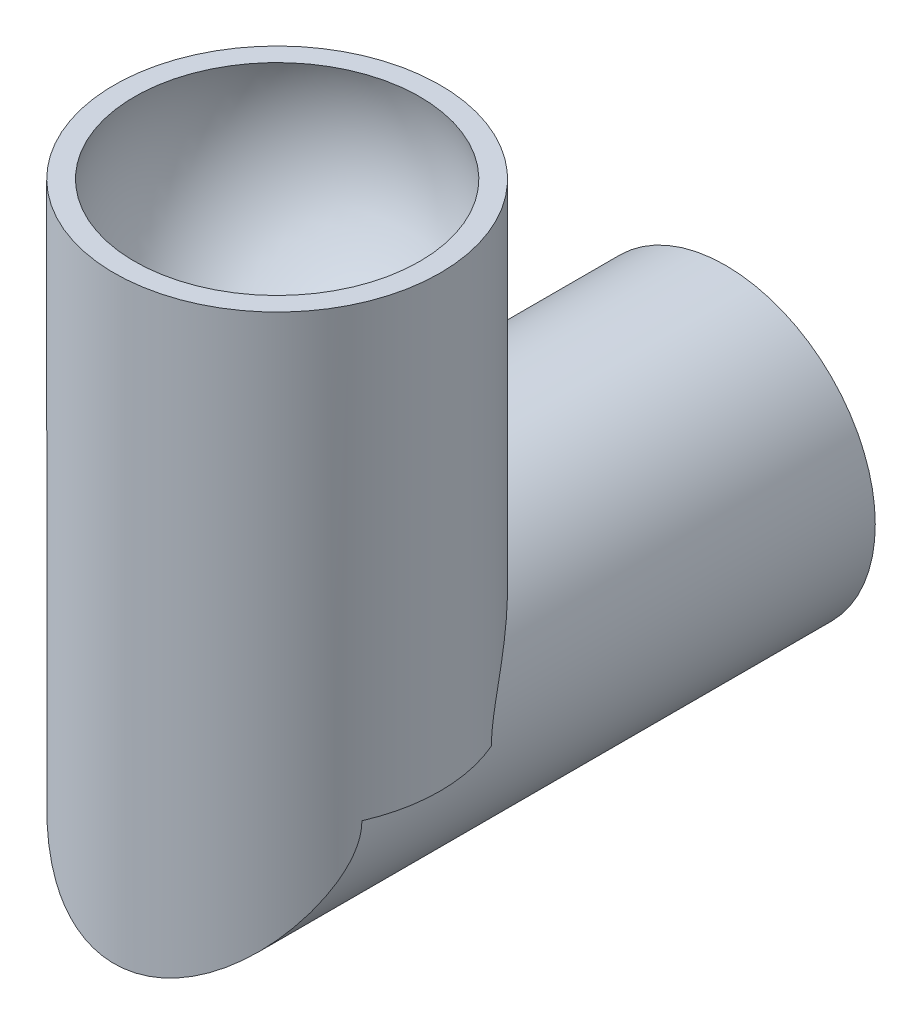
ISO-10303-21;
HEADER;
FILE_DESCRIPTION(('STEP AP214'),'2;1');
FILE_NAME('part.step','',(''),(''),'','','');
FILE_SCHEMA(('AUTOMOTIVE_DESIGN { 1 0 10303 214 1 1 1 1 }'));
ENDSEC;
DATA;
#1=APPLICATION_CONTEXT('core data for automotive mechanical design processes');
#2=APPLICATION_PROTOCOL_DEFINITION('international standard','automotive_design',2000,#1);
#3=PRODUCT_CONTEXT('',#1,'mechanical');
#4=PRODUCT('Part','Part','',(#3));
#5=PRODUCT_RELATED_PRODUCT_CATEGORY('part','',(#4));
#6=PRODUCT_DEFINITION_FORMATION('','',#4);
#7=PRODUCT_DEFINITION_CONTEXT('part definition',#1,'design');
#8=PRODUCT_DEFINITION('design','',#6,#7);
#9=PRODUCT_DEFINITION_SHAPE('','',#8);
#10=(LENGTH_UNIT() NAMED_UNIT(*) SI_UNIT(.MILLI.,.METRE.));
#11=(NAMED_UNIT(*) PLANE_ANGLE_UNIT() SI_UNIT($,.RADIAN.));
#12=(NAMED_UNIT(*) SI_UNIT($,.STERADIAN.) SOLID_ANGLE_UNIT());
#13=UNCERTAINTY_MEASURE_WITH_UNIT(LENGTH_MEASURE(1.E-05),#10,'distance_accuracy_value','');
#14=(GEOMETRIC_REPRESENTATION_CONTEXT(3) GLOBAL_UNCERTAINTY_ASSIGNED_CONTEXT((#13)) GLOBAL_UNIT_ASSIGNED_CONTEXT((#10,
#11,#12)) REPRESENTATION_CONTEXT('',''));
#15=CARTESIAN_POINT('',(0.,0.,0.));
#16=DIRECTION('',(0.,0.,1.));
#17=DIRECTION('',(1.,0.,0.));
#18=AXIS2_PLACEMENT_3D('',#15,#16,#17);
#19=CARTESIAN_POINT('',(0.,0.,0.));
#20=DIRECTION('',(0.,1.,0.));
#21=DIRECTION('',(1.,0.,0.));
#22=AXIS2_PLACEMENT_3D('',#19,#20,#21);
#23=SPHERICAL_SURFACE('',#22,20.);
#24=CARTESIAN_POINT('',(0.,-17.3205080756888,0.));
#25=DIRECTION('',(0.,1.,0.));
#26=DIRECTION('',(0.,0.,1.));
#27=AXIS2_PLACEMENT_3D('',#24,#25,#26);
#28=CIRCLE('',#27,10.);
#29=CARTESIAN_POINT('',(10.,-17.3205080756888,0.));
#30=VERTEX_POINT('',#29);
#31=EDGE_CURVE('E41',#30,#30,#28,.T.);
#32=ORIENTED_EDGE('',*,*,#31,.F.);
#33=CARTESIAN_POINT('',(0.,0.,0.));
#34=DIRECTION('',(0.,0.,-1.));
#35=DIRECTION('',(1.,0.,0.));
#36=AXIS2_PLACEMENT_3D('',#33,#34,#35);
#37=CIRCLE('',#36,20.);
#38=CARTESIAN_POINT('',(19.0787840283389,6.,0.));
#39=VERTEX_POINT('',#38);
#40=EDGE_CURVE('E125',#39,#30,#37,.T.);
#41=ORIENTED_EDGE('',*,*,#40,.F.);
#42=CARTESIAN_POINT('',(0.,6.,0.));
#43=DIRECTION('',(0.,1.,0.));
#44=DIRECTION('',(1.,0.,0.));
#45=AXIS2_PLACEMENT_3D('',#42,#43,#44);
#46=CIRCLE('',#45,19.0787840283389);
#47=EDGE_CURVE('E47',#39,#39,#46,.T.);
#48=ORIENTED_EDGE('',*,*,#47,.T.);
#49=ORIENTED_EDGE('',*,*,#40,.T.);
#50=EDGE_LOOP('',(#32,#41,#48,#49));
#51=FACE_BOUND('',#50,.T.);
#52=ADVANCED_FACE('F38',(#51),#23,.F.);
#53=CARTESIAN_POINT('',(0.,-54.,0.));
#54=DIRECTION('',(0.,1.,0.));
#55=DIRECTION('',(0.,0.,1.));
#56=AXIS2_PLACEMENT_3D('',#53,#54,#55);
#57=PLANE('',#56);
#58=DIRECTION('',(0.,0.,-1.));
#59=VECTOR('',#58,1.);
#60=CARTESIAN_POINT('',(20.,-54.,21.7954947177034));
#61=LINE('',#60,#59);
#62=CARTESIAN_POINT('',(20.,-54.,-8.66025403784439));
#63=VERTEX_POINT('',#62);
#64=CARTESIAN_POINT('',(20.,-54.,0.));
#65=VERTEX_POINT('',#64);
#66=EDGE_CURVE('E149',#63,#65,#61,.F.);
#67=ORIENTED_EDGE('',*,*,#66,.F.);
#68=CARTESIAN_POINT('',(0.,-54.,0.));
#69=DIRECTION('',(0.,1.,0.));
#70=DIRECTION('',(1.,0.,0.));
#71=AXIS2_PLACEMENT_3D('',#68,#69,#70);
#72=CIRCLE('',#71,21.7944947177034);
#73=CARTESIAN_POINT('',(21.7944947177034,-54.,0.));
#74=VERTEX_POINT('',#73);
#75=EDGE_CURVE('E141',#74,#63,#72,.T.);
#76=ORIENTED_EDGE('',*,*,#75,.F.);
#77=DIRECTION('',(1.,0.,0.));
#78=VECTOR('',#77,1.);
#79=CARTESIAN_POINT('',(0.,-54.,0.));
#80=LINE('',#79,#78);
#81=EDGE_CURVE('E144',#65,#74,#80,.T.);
#82=ORIENTED_EDGE('',*,*,#81,.F.);
#83=EDGE_LOOP('',(#67,#76,#82));
#84=FACE_BOUND('',#83,.T.);
#85=ADVANCED_FACE('F118',(#84),#57,.F.);
#86=CARTESIAN_POINT('',(20.,-54.,8.66025403784439));
#87=VERTEX_POINT('',#86);
#88=EDGE_CURVE('E58',#65,#87,#61,.F.);
#89=ORIENTED_EDGE('',*,*,#88,.F.);
#90=ORIENTED_EDGE('',*,*,#81,.T.);
#91=EDGE_CURVE('E129',#87,#74,#72,.T.);
#92=ORIENTED_EDGE('',*,*,#91,.F.);
#93=EDGE_LOOP('',(#89,#90,#92));
#94=FACE_BOUND('',#93,.T.);
#95=ADVANCED_FACE('F178',(#94),#57,.F.);
#96=DIRECTION('',(0.,0.,-1.));
#97=VECTOR('',#96,1.);
#98=CARTESIAN_POINT('',(-20.,-54.,21.7954947177034));
#99=LINE('',#98,#97);
#100=CARTESIAN_POINT('',(-20.,-54.,8.66025403784439));
#101=VERTEX_POINT('',#100);
#102=CARTESIAN_POINT('',(-20.,-54.,-8.66025403784439));
#103=VERTEX_POINT('',#102);
#104=EDGE_CURVE('E106',#101,#103,#99,.T.);
#105=ORIENTED_EDGE('',*,*,#104,.F.);
#106=EDGE_CURVE('E147',#103,#101,#72,.T.);
#107=ORIENTED_EDGE('',*,*,#106,.F.);
#108=EDGE_LOOP('',(#105,#107));
#109=FACE_BOUND('',#108,.T.);
#110=ADVANCED_FACE('F116',(#109),#57,.F.);
#111=CARTESIAN_POINT('',(0.,0.,0.));
#112=DIRECTION('',(0.,1.,0.));
#113=DIRECTION('',(0.,0.,1.));
#114=AXIS2_PLACEMENT_3D('',#111,#112,#113);
#115=CYLINDRICAL_SURFACE('',#114,21.7944947177034);
#116=ORIENTED_EDGE('',*,*,#106,.T.);
#117=CARTESIAN_POINT('',(-20.,-54.,8.66025403784439));
#118=CARTESIAN_POINT('',(-20.0000002181586,-53.7173098730834,8.66025323613514));
#119=CARTESIAN_POINT('',(-19.9939860074078,-53.4346227360958,8.67418250162669));
#120=CARTESIAN_POINT('',(-19.9701699644675,-52.872380670673,8.72887003086645));
#121=CARTESIAN_POINT('',(-19.9523667338552,-52.5928261178286,8.7696314774655));
#122=CARTESIAN_POINT('',(-19.905507299474,-52.0382156924432,8.87547768294981));
#123=CARTESIAN_POINT('',(-19.8764050631632,-51.7631830828896,8.94066190256756));
#124=CARTESIAN_POINT('',(-19.807757223014,-51.2201184296182,9.09173293742635));
#125=CARTESIAN_POINT('',(-19.7682057411567,-50.9520904197519,9.17763140268163));
#126=CARTESIAN_POINT('',(-19.6903162183122,-50.4882373422918,9.34332145557701));
#127=CARTESIAN_POINT('',(-19.6540351984894,-50.290746772801,9.41949230992989));
#128=CARTESIAN_POINT('',(-19.5763028148616,-49.9002469285364,9.57999661365893));
#129=CARTESIAN_POINT('',(-19.5348531396497,-49.7072362145149,9.66432739519051));
#130=CARTESIAN_POINT('',(-19.4030789128736,-49.1343792145296,9.92768455001428));
#131=CARTESIAN_POINT('',(-19.3053678638448,-48.7609345853959,10.1169916028781));
#132=CARTESIAN_POINT('',(-19.0915856428432,-48.0286255098291,10.5148760412783));
#133=CARTESIAN_POINT('',(-18.9754601412268,-47.6698082867448,10.7235096653294));
#134=CARTESIAN_POINT('',(-18.7260196975912,-46.9661198045016,11.1533826634754));
#135=CARTESIAN_POINT('',(-18.5927076303157,-46.6212462256768,11.3746199259524));
#136=CARTESIAN_POINT('',(-18.3221604052598,-45.9744162228442,11.8049632974064));
#137=CARTESIAN_POINT('',(-18.1863566954197,-45.6713897310386,12.0133706341887));
#138=CARTESIAN_POINT('',(-17.9011153936051,-45.0747887144134,12.434417778129));
#139=CARTESIAN_POINT('',(-17.7516760063951,-44.7812154410819,12.6470581397058));
#140=CARTESIAN_POINT('',(-17.4391496320678,-44.2028493752021,13.0746406943699));
#141=CARTESIAN_POINT('',(-17.2760550564861,-43.9180615868362,13.289584108677));
#142=CARTESIAN_POINT('',(-16.9362549350535,-43.3571261090856,13.7200039122352));
#143=CARTESIAN_POINT('',(-16.7595480995997,-43.0809792418209,13.9354803501077));
#144=CARTESIAN_POINT('',(-16.2093225689949,-42.2659643364856,14.5800035815113));
#145=CARTESIAN_POINT('',(-15.8152643829554,-41.7397182302326,15.0077476167439));
#146=CARTESIAN_POINT('',(-14.9715141105303,-40.7225788507391,15.8495735537612));
#147=CARTESIAN_POINT('',(-14.5218520875835,-40.2316666986108,16.2636626862855));
#148=CARTESIAN_POINT('',(-13.68619273838,-39.4075325962288,16.9678144329702));
#149=CARTESIAN_POINT('',(-13.3127531132741,-39.0657728746497,17.2628115670193));
#150=CARTESIAN_POINT('',(-12.5336032060727,-38.4061111498612,17.8365597238682));
#151=CARTESIAN_POINT('',(-12.1278932470843,-38.0882089078403,18.1153109092824));
#152=CARTESIAN_POINT('',(-11.28469027834,-37.4795396500141,18.6522146193207));
#153=CARTESIAN_POINT('',(-10.8472434301416,-37.1887345747347,18.9103959591732));
#154=CARTESIAN_POINT('',(-10.167496627424,-36.7752400346196,19.2792243884661));
#155=CARTESIAN_POINT('',(-9.93699754752422,-36.64120041839,19.3990875098621));
#156=CARTESIAN_POINT('',(-9.46816947821634,-36.3810996470987,19.6321755071993));
#157=CARTESIAN_POINT('',(-9.22983850285025,-36.2550405397672,19.7453986788418));
#158=CARTESIAN_POINT('',(-8.60122041397744,-35.9388231235526,20.0299503450528));
#159=CARTESIAN_POINT('',(-8.20503187527646,-35.7552434610646,20.195687755668));
#160=CARTESIAN_POINT('',(-7.39461327928373,-35.4120119892369,20.506290956209));
#161=CARTESIAN_POINT('',(-6.9803872151684,-35.2523549182834,20.6511613354265));
#162=CARTESIAN_POINT('',(-6.13563947302082,-34.9591568342897,20.9176953239157));
#163=CARTESIAN_POINT('',(-5.70512293260524,-34.8256076680522,21.039366177838));
#164=CARTESIAN_POINT('',(-4.83001811404516,-34.5866895870674,21.257333493972));
#165=CARTESIAN_POINT('',(-4.38542968348797,-34.4813209776608,21.3536296812452));
#166=CARTESIAN_POINT('',(-3.48213717464802,-34.3000431374666,21.5194551224761));
#167=CARTESIAN_POINT('',(-3.02335848288581,-34.2243360001877,21.5888007282639));
#168=CARTESIAN_POINT('',(-2.09817981942371,-34.1048958522434,21.6982625287673));
#169=CARTESIAN_POINT('',(-1.63177982700866,-34.0611629285006,21.7383786440219));
#170=CARTESIAN_POINT('',(-0.695597032782698,-34.006603011149,21.7884328297196));
#171=CARTESIAN_POINT('',(-0.225815436384534,-33.9957648226582,21.7983811669937));
#172=CARTESIAN_POINT('',(0.71297947005694,-34.0072018972209,21.787885835485));
#173=CARTESIAN_POINT('',(1.18199283907719,-34.0294744863835,21.7674446208382));
#174=CARTESIAN_POINT('',(2.06530577067367,-34.1025243962162,21.7004459283693));
#175=CARTESIAN_POINT('',(2.48011420442691,-34.1500144588067,21.6569006581961));
#176=CARTESIAN_POINT('',(3.30291137758265,-34.2702354772798,21.5467637132669));
#177=CARTESIAN_POINT('',(3.71090070280497,-34.3429642531369,21.4801740290024));
#178=CARTESIAN_POINT('',(4.51760394543257,-34.5125379052083,21.3251026467764));
#179=CARTESIAN_POINT('',(4.91631708819827,-34.6093847876403,21.2366191276227));
#180=CARTESIAN_POINT('',(5.7023327498304,-34.8258090333977,21.0391928175195));
#181=CARTESIAN_POINT('',(6.0896345963353,-34.9453877330165,20.9302488238024));
#182=CARTESIAN_POINT('',(6.86799952220862,-35.2115146474862,20.6882570544218));
#183=CARTESIAN_POINT('',(7.25846701372033,-35.3590240822068,20.5543542745734));
#184=CARTESIAN_POINT('',(8.02357744699046,-35.675328120127,20.2679327400102));
#185=CARTESIAN_POINT('',(8.39822038892056,-35.8441227230957,20.1154139854972));
#186=CARTESIAN_POINT('',(9.13071844067577,-36.2012349686342,19.7936865244603));
#187=CARTESIAN_POINT('',(9.48857039415525,-36.3895562606164,19.624474698397));
#188=CARTESIAN_POINT('',(10.186781511005,-36.7840094195481,19.2712902052198));
#189=CARTESIAN_POINT('',(10.5271369230765,-36.9901450807489,19.0873143941495));
#190=CARTESIAN_POINT('',(11.364351076302,-37.5314164664229,18.6062277709394));
#191=CARTESIAN_POINT('',(11.8493420109433,-37.8773645482935,18.3005177721728));
#192=CARTESIAN_POINT('',(12.7772364952457,-38.6022986621762,17.6651829896414));
#193=CARTESIAN_POINT('',(13.2201208475804,-38.9812996141784,17.3355474173067));
#194=CARTESIAN_POINT('',(14.0652328492838,-39.7696067867508,16.6572382246657));
#195=CARTESIAN_POINT('',(14.4673408966635,-40.1789963856201,16.3085129705188));
#196=CARTESIAN_POINT('',(15.2301122085117,-41.0243381677614,15.5985595859315));
#197=CARTESIAN_POINT('',(15.5907832301393,-41.4602853558981,15.2373338121623));
#198=CARTESIAN_POINT('',(16.2800253794634,-42.3684143764015,14.4990363382363));
#199=CARTESIAN_POINT('',(16.6075808508258,-42.8412260447671,14.1217937349732));
#200=CARTESIAN_POINT('',(17.2210021155938,-43.8133534925644,13.3668761897601));
#201=CARTESIAN_POINT('',(17.5068496355141,-44.3126807593654,12.9892011309378));
#202=CARTESIAN_POINT('',(17.9039335548015,-45.081928418759,12.4298609673716));
#203=CARTESIAN_POINT('',(18.0308814756909,-45.341400014826,12.2448253595736));
#204=CARTESIAN_POINT('',(18.2743136697814,-45.867745169372,11.8784581124939));
#205=CARTESIAN_POINT('',(18.3907991440065,-46.1346178736348,11.6971260499193));
#206=CARTESIAN_POINT('',(18.6130777358044,-46.6761393567482,11.3400850634718));
#207=CARTESIAN_POINT('',(18.7188790229736,-46.9507819854734,11.1643719144748));
#208=CARTESIAN_POINT('',(18.9196009774274,-47.5087297193632,10.8207326635737));
#209=CARTESIAN_POINT('',(19.0145241055511,-47.7920328469218,10.6528048056325));
#210=CARTESIAN_POINT('',(19.179996365797,-48.3260244707959,10.3514646896033));
#211=CARTESIAN_POINT('',(19.2520792626052,-48.5754141840353,10.2165989872973));
#212=CARTESIAN_POINT('',(19.3876114674734,-49.0817477001144,9.95700506127568));
#213=CARTESIAN_POINT('',(19.4510608938341,-49.3386913993864,9.83227669866193));
#214=CARTESIAN_POINT('',(19.5687069171389,-49.8603018351053,9.59599445434446));
#215=CARTESIAN_POINT('',(19.6229144289482,-50.1249590229126,9.4844250803392));
#216=CARTESIAN_POINT('',(19.7214494139646,-50.6624801407606,9.27779850370139));
#217=CARTESIAN_POINT('',(19.7657786963942,-50.9353425575858,9.18273827808174));
#218=CARTESIAN_POINT('',(19.8369291692729,-51.4407892821002,9.02785714096238));
#219=CARTESIAN_POINT('',(19.8654542591063,-51.6721311298799,8.96478304381243));
#220=CARTESIAN_POINT('',(19.9146562295311,-52.1394551446626,8.85494786165759));
#221=CARTESIAN_POINT('',(19.9353355770195,-52.3754358285129,8.80818164942183));
#222=CARTESIAN_POINT('',(19.9683543754352,-52.8504826225526,8.73307053278269));
#223=CARTESIAN_POINT('',(19.9807090588017,-53.0895422771683,8.70469198637119));
#224=CARTESIAN_POINT('',(19.9968071540248,-53.5694888735251,8.66764802734096));
#225=CARTESIAN_POINT('',(20.0005508688834,-53.8103757506708,8.65898192108285));
#226=CARTESIAN_POINT('',(19.9993166387462,-54.2925790937959,8.66183212934424));
#227=CARTESIAN_POINT('',(19.9943179417662,-54.5338952199114,8.67339646516107));
#228=CARTESIAN_POINT('',(19.975704692627,-55.0144234191864,8.71617773009543));
#229=CARTESIAN_POINT('',(19.9620898065274,-55.253635410431,8.74739542092381));
#230=CARTESIAN_POINT('',(19.9265718028857,-55.7287588052133,8.82800428845709));
#231=CARTESIAN_POINT('',(19.9046537266751,-55.9646634502093,8.87742826034796));
#232=CARTESIAN_POINT('',(19.8530126605036,-56.4316945290448,8.99232169524248));
#233=CARTESIAN_POINT('',(19.8232865704032,-56.6628190255379,9.05779753088235));
#234=CARTESIAN_POINT('',(19.7369088232229,-57.2540534969664,9.24501888743525));
#235=CARTESIAN_POINT('',(19.6747051023025,-57.6100516755527,9.37720652023174));
#236=CARTESIAN_POINT('',(19.533772653167,-58.3079829554824,9.66735365308522));
#237=CARTESIAN_POINT('',(19.4550319195193,-58.649905621505,9.825331857758));
#238=CARTESIAN_POINT('',(19.2821123728672,-59.3217368495311,10.1605044439271));
#239=CARTESIAN_POINT('',(19.1878762854084,-59.6515950698125,10.3377692582459));
#240=CARTESIAN_POINT('',(18.9851426861016,-60.2991631739882,10.7055342513119));
#241=CARTESIAN_POINT('',(18.876647328093,-60.6168748832556,10.8960324291367));
#242=CARTESIAN_POINT('',(18.6487245647575,-61.2339925447484,11.281579978573));
#243=CARTESIAN_POINT('',(18.5296195866636,-61.5336543644439,11.4764124586995));
#244=CARTESIAN_POINT('',(18.2786671294377,-62.1236132465017,11.8720356496559));
#245=CARTESIAN_POINT('',(18.1468175182173,-62.4139087310689,12.0728273535154));
#246=CARTESIAN_POINT('',(17.8704605331824,-62.9859671823818,12.478255754867));
#247=CARTESIAN_POINT('',(17.7259451690476,-63.2677246097864,12.6828948146346));
#248=CARTESIAN_POINT('',(17.4243705454878,-63.8229879270729,13.0941357589195));
#249=CARTESIAN_POINT('',(17.2673099980984,-64.0964929657331,13.3007378430494));
#250=CARTESIAN_POINT('',(16.7774202003165,-64.9048360239177,13.9210431335915));
#251=CARTESIAN_POINT('',(16.4257198716374,-65.4278384673526,14.335488121516));
#252=CARTESIAN_POINT('',(15.6714862894205,-66.4420035297239,15.156364251833));
#253=CARTESIAN_POINT('',(15.2689776990676,-66.9331814229408,15.5627991725174));
#254=CARTESIAN_POINT('',(14.4874463003141,-67.7982235176822,16.2894514428886));
#255=CARTESIAN_POINT('',(14.1168000280418,-68.1775004486168,16.6122331649453));
#256=CARTESIAN_POINT('',(13.3395254386684,-68.9111604327322,17.2426068417245));
#257=CARTESIAN_POINT('',(12.9328952446459,-69.2655421856491,17.550198002802));
#258=CARTESIAN_POINT('',(12.0839661204974,-69.9459404577074,18.1451329048207));
#259=CARTESIAN_POINT('',(11.6417288021715,-70.2720040267987,18.4325100736635));
#260=CARTESIAN_POINT('',(10.9515813888788,-70.7373785815998,18.8450183166093));
#261=CARTESIAN_POINT('',(10.7170853807976,-70.8885396440066,18.9794188738893));
#262=CARTESIAN_POINT('',(10.2391432280222,-71.1825108607972,19.2414717815902));
#263=CARTESIAN_POINT('',(9.99569486522776,-71.3253189225646,19.3691224402458));
#264=CARTESIAN_POINT('',(9.36515353753945,-71.6772719985997,19.6844336911376));
#265=CARTESIAN_POINT('',(8.97197865529389,-71.8802308028201,19.8669531051324));
#266=CARTESIAN_POINT('',(8.16581776719176,-72.2624853900226,20.2116687997454));
#267=CARTESIAN_POINT('',(7.75283644044906,-72.4417867247122,20.3738698480285));
#268=CARTESIAN_POINT('',(6.9085338101535,-72.7743955414388,20.6754203100173));
#269=CARTESIAN_POINT('',(6.47721725360813,-72.9277097009277,20.8147755936806));
#270=CARTESIAN_POINT('',(5.59826110090581,-73.2060394264467,21.068190186091));
#271=CARTESIAN_POINT('',(5.15062129057638,-73.3310546210193,21.1822491627938));
#272=CARTESIAN_POINT('',(4.23827719810069,-73.551442698056,21.3835657315225));
#273=CARTESIAN_POINT('',(3.77346698111548,-73.6465765565221,21.470607145194));
#274=CARTESIAN_POINT('',(2.83369637039559,-73.8039670702363,21.6147197358548));
#275=CARTESIAN_POINT('',(2.35873594805067,-73.8662236328009,21.6717908283556));
#276=CARTESIAN_POINT('',(1.40309503967203,-73.9564913385556,21.7545678457301));
#277=CARTESIAN_POINT('',(0.922417679138653,-73.9845203970156,21.7802901790747));
#278=CARTESIAN_POINT('',(-0.0403276556050364,-74.0057523853042,21.7997731206144));
#279=CARTESIAN_POINT('',(-0.522395475521236,-73.9989590410953,21.7935371483163));
#280=CARTESIAN_POINT('',(-1.42482967353366,-73.9536591911724,21.7519758237621));
#281=CARTESIAN_POINT('',(-1.8455724388862,-73.9191084845982,21.7202790575392));
#282=CARTESIAN_POINT('',(-2.68154055987439,-73.8238814369363,21.6329820412924));
#283=CARTESIAN_POINT('',(-3.09676645269123,-73.7632076589731,21.5773841363836));
#284=CARTESIAN_POINT('',(-3.91899529533253,-73.6167248845016,21.4432979495101));
#285=CARTESIAN_POINT('',(-4.32599785549287,-73.5309146998722,21.3648085855369));
#286=CARTESIAN_POINT('',(-5.12940480506747,-73.3354635791706,21.1862825935361));
#287=CARTESIAN_POINT('',(-5.52580863042417,-73.2258213775983,21.0862448212724));
#288=CARTESIAN_POINT('',(-6.3142245275019,-72.9816869005666,20.8638885243418));
#289=CARTESIAN_POINT('',(-6.7059700383375,-72.8467215878989,20.7411466332239));
#290=CARTESIAN_POINT('',(-7.47470630805457,-72.5552625621185,20.4766701255285));
#291=CARTESIAN_POINT('',(-7.85169731345702,-72.3987692088975,20.3349358264547));
#292=CARTESIAN_POINT('',(-8.58984098737207,-72.0659509788934,20.0343076432608));
#293=CARTESIAN_POINT('',(-8.95098960426935,-71.8896210696324,19.875409405107));
#294=CARTESIAN_POINT('',(-9.65657948442922,-71.5188295126264,19.5423324459834));
#295=CARTESIAN_POINT('',(-10.0010171835041,-71.324364022455,19.3681504872816));
#296=CARTESIAN_POINT('',(-10.8415418192467,-70.8169101146012,18.915324320168));
#297=CARTESIAN_POINT('',(-11.3268105376719,-70.4934871712489,18.6281877550802));
#298=CARTESIAN_POINT('',(-12.257711292,-69.8139474265422,18.0292852929359));
#299=CARTESIAN_POINT('',(-12.7033262333679,-69.4578166581646,17.7175088820781));
#300=CARTESIAN_POINT('',(-13.5558640332685,-68.7159290179478,17.0740838916891));
#301=CARTESIAN_POINT('',(-13.9626981640401,-68.3301076934879,16.7423924438954));
#302=CARTESIAN_POINT('',(-14.7370440634328,-67.5324980006376,16.0649969082087));
#303=CARTESIAN_POINT('',(-15.1045615671838,-67.1207134334805,15.7192948742166));
#304=CARTESIAN_POINT('',(-15.8093634698786,-66.2629311155817,15.0106477113269));
#305=CARTESIAN_POINT('',(-16.1457253546917,-65.8163539438068,14.6474881064216));
#306=CARTESIAN_POINT('',(-16.7789295132011,-64.8985552986156,13.9176497690795));
#307=CARTESIAN_POINT('',(-17.0757614029585,-64.4273273949199,13.5509701389971));
#308=CARTESIAN_POINT('',(-17.6298647676537,-63.4603449721211,12.8217338143147));
#309=CARTESIAN_POINT('',(-17.887196379649,-62.9646292864424,12.459171646366));
#310=CARTESIAN_POINT('',(-18.243630712511,-62.2005314374618,11.9254295865535));
#311=CARTESIAN_POINT('',(-18.3574988650917,-61.9424550592149,11.7492269247061));
#312=CARTESIAN_POINT('',(-18.5752737371482,-61.4188700108096,11.4018056212048));
#313=CARTESIAN_POINT('',(-18.6791817622579,-61.153362320704,11.2305863283553));
#314=CARTESIAN_POINT('',(-18.8788583157149,-60.608674622323,10.8916568131154));
#315=CARTESIAN_POINT('',(-18.9744142388035,-60.3293254521979,10.7240922486009));
#316=CARTESIAN_POINT('',(-19.1544990312926,-59.7614136841177,10.3990224105489));
#317=CARTESIAN_POINT('',(-19.2390305124482,-59.4728532885937,10.2415147589993));
#318=CARTESIAN_POINT('',(-19.3964797053749,-58.8855901373402,9.94009444862892));
#319=CARTESIAN_POINT('',(-19.469398130773,-58.586888006194,9.79618095466303));
#320=CARTESIAN_POINT('',(-19.6027461054577,-57.9785976669536,9.52653999439953));
#321=CARTESIAN_POINT('',(-19.6631776259258,-57.6690111861046,9.40080965865213));
#322=CARTESIAN_POINT('',(-19.7622374357159,-57.0866541029859,9.190505475247));
#323=CARTESIAN_POINT('',(-19.8027830867078,-56.8154315282569,9.1025811610462));
#324=CARTESIAN_POINT('',(-19.8731793752741,-56.2657103497799,8.94784827274143));
#325=CARTESIAN_POINT('',(-19.9030352872626,-55.9872154072665,8.88102928700017));
#326=CARTESIAN_POINT('',(-19.9511127555116,-55.425537977826,8.77249397271555));
#327=CARTESIAN_POINT('',(-19.9693834265862,-55.142380572361,8.73067171622278));
#328=CARTESIAN_POINT('',(-19.9938259956232,-54.5728140791058,8.67455429972265));
#329=CARTESIAN_POINT('',(-19.9999997789742,-54.2864055050337,8.66025485009046));
#330=CARTESIAN_POINT('',(-20.,-54.,8.66025403784439));
#331=B_SPLINE_CURVE_WITH_KNOTS('',3,(#117,#118,#119,#120,#121,#122,#123,#124,#125,#126,#127,
#128,#129,#130,#131,#132,#133,#134,#135,#136,#137,#138,#139,#140,#141,#142,#143,#144,#145,#146,
#147,#148,#149,#150,#151,#152,#153,#154,#155,#156,#157,#158,#159,#160,#161,#162,#163,#164,#165,
#166,#167,#168,#169,#170,#171,#172,#173,#174,#175,#176,#177,#178,#179,#180,#181,#182,#183,#184,
#185,#186,#187,#188,#189,#190,#191,#192,#193,#194,#195,#196,#197,#198,#199,#200,#201,#202,#203,
#204,#205,#206,#207,#208,#209,#210,#211,#212,#213,#214,#215,#216,#217,#218,#219,#220,#221,#222,
#223,#224,#225,#226,#227,#228,#229,#230,#231,#232,#233,#234,#235,#236,#237,#238,#239,#240,#241,
#242,#243,#244,#245,#246,#247,#248,#249,#250,#251,#252,#253,#254,#255,#256,#257,#258,#259,#260,
#261,#262,#263,#264,#265,#266,#267,#268,#269,#270,#271,#272,#273,#274,#275,#276,#277,#278,#279,
#280,#281,#282,#283,#284,#285,#286,#287,#288,#289,#290,#291,#292,#293,#294,#295,#296,#297,#298,
#299,#300,#301,#302,#303,#304,#305,#306,#307,#308,#309,#310,#311,#312,#313,#314,#315,#316,#317,
#318,#319,#320,#321,#322,#323,#324,#325,#326,#327,#328,#329,#330),.UNSPECIFIED.,.T.,.F.,(4,2,2,
2,2,2,2,2,2,2,2,2,2,2,2,2,2,2,2,2,2,2,2,2,2,2,2,2,2,2,2,2,2,2,2,2,2,2,2,2,2,2,2,2,2,2,2,2,2,2,2,
2,2,2,2,2,2,2,2,2,2,2,2,2,2,2,2,2,2,2,2,2,2,2,2,2,2,2,2,2,2,2,2,2,2,2,2,2,2,2,2,2,2,2,2,2,2,2,2,
2,2,2,2,2,2,2,4),(0.,0.847676572336322,1.69545371474494,2.54672159918146,3.39846937113223,
4.04246775462997,4.68625629319036,5.97456468357953,7.26674732623712,8.55871410924735,
9.73447136541326,10.910383642501,12.0869537912878,13.2636355437941,15.6137242496188,
17.9625478387531,19.7188073034611,21.4750491858071,23.2287859247675,24.1055630374938,
24.9825642194285,26.3822943248522,27.7817161156833,29.1807001826635,30.5796994072315,
31.9880712774351,33.396446976315,34.8043433167614,36.2121259674336,37.4700270658721,
38.727819538557,39.9857166732325,41.243687776467,42.5574748033206,43.8712618159192,
45.1852948109311,46.4996083725654,48.5053837667462,50.5120692966611,52.5244800634965,
54.5365134838732,56.5983548174334,58.6610968093735,59.6900245205646,60.7188339658617,
61.7468506851346,62.7746343871821,63.6519191065745,64.5291918036958,65.4054211391794,
66.2814898589165,67.0052883145524,67.7288590009304,68.4511020786025,69.1733197416649,
69.8972540703493,70.6212164584965,71.3464893568137,72.0720506581706,73.2244722795109,
74.3777334383849,75.5353573116346,76.6928065282358,77.8226517808163,78.9526863768603,
80.0834390701678,81.2143080029673,83.4747123813017,85.7340237106525,87.5948957749289,
89.4558649595699,91.3136805532467,92.2424507127904,93.1714525624838,94.605951023253,
96.0401122487044,97.4739044033462,98.9077153771145,100.352719517975,101.797727732385,
103.241979279767,104.686076296899,105.954613164494,107.22302559507,108.491497989302,
109.760037756951,111.055187906502,112.3503164072,113.645774222462,114.941507135571,
116.888674024925,118.836676301805,120.789033561233,122.7411056402,124.739423746316,
126.738265749643,128.734033778159,129.731593482847,130.729022242013,131.747065228357,
132.764866594526,133.782605392232,134.80018340684,135.663243216931,136.525876596742,
137.384828012151,138.243645543041),.UNSPECIFIED.);
#332=EDGE_CURVE('E97',#87,#101,#331,.T.);
#333=ORIENTED_EDGE('',*,*,#332,.F.);
#334=ORIENTED_EDGE('',*,*,#91,.T.);
#335=DIRECTION('',(0.,1.,0.));
#336=VECTOR('',#335,1.);
#337=CARTESIAN_POINT('',(21.7944947177034,6.,0.));
#338=LINE('',#337,#336);
#339=CARTESIAN_POINT('',(21.7944947177034,6.,0.));
#340=VERTEX_POINT('',#339);
#341=EDGE_CURVE('E137',#74,#340,#338,.T.);
#342=ORIENTED_EDGE('',*,*,#341,.T.);
#343=CARTESIAN_POINT('',(0.,6.,0.));
#344=DIRECTION('',(0.,1.,0.));
#345=DIRECTION('',(1.,0.,0.));
#346=AXIS2_PLACEMENT_3D('',#343,#344,#345);
#347=CIRCLE('',#346,21.7944947177034);
#348=EDGE_CURVE('E134',#340,#340,#347,.T.);
#349=ORIENTED_EDGE('',*,*,#348,.F.);
#350=ORIENTED_EDGE('',*,*,#341,.F.);
#351=ORIENTED_EDGE('',*,*,#75,.T.);
#352=CARTESIAN_POINT('',(-20.,-54.,-8.66025403784439));
#353=CARTESIAN_POINT('',(-20.0000032129467,-53.8566030924953,-8.66023805226546));
#354=CARTESIAN_POINT('',(-19.9984572156965,-53.7132355439203,-8.66381777264993));
#355=CARTESIAN_POINT('',(-19.9923007320043,-53.4269512319345,-8.67801831321608));
#356=CARTESIAN_POINT('',(-19.9876910307751,-53.2840343624444,-8.6886373292577));
#357=CARTESIAN_POINT('',(-19.9693565376571,-52.8573796470327,-8.73073778609742));
#358=CARTESIAN_POINT('',(-19.9511258681727,-52.5747851682296,-8.77246465479545));
#359=CARTESIAN_POINT('',(-19.9037445544616,-52.0209045220442,-8.87942781181461));
#360=CARTESIAN_POINT('',(-19.8748129109955,-51.7495053222279,-8.94419168210797));
#361=CARTESIAN_POINT('',(-19.8067743152776,-51.2134682453059,-9.09386905643543));
#362=CARTESIAN_POINT('',(-19.7676587369047,-50.9488363099921,-9.17879963693145));
#363=CARTESIAN_POINT('',(-19.6570832142784,-50.2903206014749,-9.41400913256731));
#364=CARTESIAN_POINT('',(-19.5794163706986,-49.9013935369153,-9.57520698535038));
#365=CARTESIAN_POINT('',(-19.4046023197538,-49.1405772737431,-9.92469780359373));
#366=CARTESIAN_POINT('',(-19.3074439015225,-48.7686980323566,-10.1130063444843));
#367=CARTESIAN_POINT('',(-19.0939883345038,-48.0362128562885,-10.5105241371624));
#368=CARTESIAN_POINT('',(-18.9774837645123,-47.6757859509745,-10.7199490148513));
#369=CARTESIAN_POINT('',(-18.7271401239107,-46.9690151573204,-11.1515241276392));
#370=CARTESIAN_POINT('',(-18.5933033217832,-46.6226694337836,-11.3736726953138));
#371=CARTESIAN_POINT('',(-18.3220061740112,-45.9740483759704,-11.8052083513778));
#372=CARTESIAN_POINT('',(-18.1860311101887,-45.6706634566571,-12.0138701605866));
#373=CARTESIAN_POINT('',(-17.9004144589291,-45.0733681207766,-12.4354334331172));
#374=CARTESIAN_POINT('',(-17.7507710307878,-44.7794589875357,-12.6483354644375));
#375=CARTESIAN_POINT('',(-17.4378058476573,-44.2004448693139,-13.0764397006763));
#376=CARTESIAN_POINT('',(-17.2744766645136,-43.9153447819873,-13.2916430986932));
#377=CARTESIAN_POINT('',(-16.9341747123195,-43.3538045124844,-13.7225785446372));
#378=CARTESIAN_POINT('',(-16.7572006498805,-43.0773651547539,-13.938310640798));
#379=CARTESIAN_POINT('',(-16.2069991728983,-42.2627990072837,-14.5825631469008));
#380=CARTESIAN_POINT('',(-15.8133134456314,-41.737244155311,-15.0097764172108));
#381=CARTESIAN_POINT('',(-14.9704392986637,-40.7214056970681,-15.8505632893512));
#382=CARTESIAN_POINT('',(-14.5212807888422,-40.2311033070256,-16.2641440904632));
#383=CARTESIAN_POINT('',(-13.6862746796058,-39.4076133864425,-16.9677453788576));
#384=CARTESIAN_POINT('',(-13.3129241632633,-39.0659294227935,-17.2626764382874));
#385=CARTESIAN_POINT('',(-12.5339670263686,-38.4064074529034,-17.8363009803469));
#386=CARTESIAN_POINT('',(-12.1283606929612,-38.0885692344337,-18.1149946074859));
#387=CARTESIAN_POINT('',(-11.2851868941886,-37.4798753001723,-18.6519170093395));
#388=CARTESIAN_POINT('',(-10.8476508251567,-37.1889937004234,-18.9101653802826));
#389=CARTESIAN_POINT('',(-10.1677593306574,-36.7753941918984,-19.279086606879));
#390=CARTESIAN_POINT('',(-9.93721022804156,-36.6413212316977,-19.3989793609264));
#391=CARTESIAN_POINT('',(-9.46827849656249,-36.3811573100162,-19.632123715507));
#392=CARTESIAN_POINT('',(-9.2298938808867,-36.2550683971026,-19.7453736110541));
#393=CARTESIAN_POINT('',(-8.60120551389194,-35.9388156279576,-20.0299570901452));
#394=CARTESIAN_POINT('',(-8.2050013436176,-35.7552293135854,-20.1957005279469));
#395=CARTESIAN_POINT('',(-7.3945501677428,-35.411986476475,-20.5063140739708));
#396=CARTESIAN_POINT('',(-6.98030715763666,-35.2523246890429,-20.6511887741754));
#397=CARTESIAN_POINT('',(-6.13555692351556,-34.9591306245138,-20.9177191918365));
#398=CARTESIAN_POINT('',(-5.70505609962234,-34.8255881904862,-21.0393839344029));
#399=CARTESIAN_POINT('',(-4.82998389646551,-34.5866814761436,-21.2573409066641));
#400=CARTESIAN_POINT('',(-4.38541236460119,-34.4813175015488,-21.3536328610783));
#401=CARTESIAN_POINT('',(-3.4821390225289,-34.3000435087729,-21.5194547827901));
#402=CARTESIAN_POINT('',(-3.02336221756375,-34.2243366165278,-21.5888001637226));
#403=CARTESIAN_POINT('',(-2.0981873630593,-34.1048966919471,-21.6982617589057));
#404=CARTESIAN_POINT('',(-1.63178929253685,-34.0611637476585,-21.7383778926673));
#405=CARTESIAN_POINT('',(-0.695606547549013,-34.0066032982268,-21.7884325662096));
#406=CARTESIAN_POINT('',(-0.225823049892303,-33.9957648639781,-21.7983811290774));
#407=CARTESIAN_POINT('',(0.712975668780073,-34.0072017168705,-21.787886000983));
#408=CARTESIAN_POINT('',(1.1819909487723,-34.0294743300785,-21.7674447641955));
#409=CARTESIAN_POINT('',(2.06530737208831,-34.1025245286324,-21.7004458069219));
#410=CARTESIAN_POINT('',(2.48011739160297,-34.1500148237612,-21.6569003235381));
#411=CARTESIAN_POINT('',(3.30291767341697,-34.2702364978958,-21.5467627785757));
#412=CARTESIAN_POINT('',(3.71090852155547,-34.3429656968075,-21.4801727075514));
#413=CARTESIAN_POINT('',(4.51761162426555,-34.5125397192789,-21.3251009891536));
#414=CARTESIAN_POINT('',(4.91632317558765,-34.6093863641603,-21.2366176884321));
#415=CARTESIAN_POINT('',(5.70233573113289,-34.8258099539034,-21.0391919788755));
#416=CARTESIAN_POINT('',(6.08963606317858,-34.945388234692,-20.9302483676028));
#417=CARTESIAN_POINT('',(6.86798762884996,-35.2115105809254,-20.6882607522069));
#418=CARTESIAN_POINT('',(7.25844365216427,-35.3590152563756,-20.5543622863786));
#419=CARTESIAN_POINT('',(8.02353212328869,-35.6753085507193,-20.2679504408377));
#420=CARTESIAN_POINT('',(8.39816457175206,-35.8440971687342,-20.1154370618935));
#421=CARTESIAN_POINT('',(9.13066462005687,-36.2012070715104,-19.7937116032203));
#422=CARTESIAN_POINT('',(9.48852805515972,-36.3895331716501,-19.6244954072703));
#423=CARTESIAN_POINT('',(10.1867611141779,-36.7839970657013,-19.271301231085));
#424=CARTESIAN_POINT('',(10.5271269852955,-36.9901386553895,-19.087320105626));
#425=CARTESIAN_POINT('',(11.3644465420252,-37.531478187097,-18.6061729122198));
#426=CARTESIAN_POINT('',(11.8495251238934,-37.8774951639821,-18.3004023444287));
#427=CARTESIAN_POINT('',(12.7775789061529,-38.6025786409853,-17.6649385729483));
#428=CARTESIAN_POINT('',(13.2205349056476,-38.9816600634788,-17.3352345791991));
#429=CARTESIAN_POINT('',(14.0656151692061,-39.7699892796107,-16.6569118021418));
#430=CARTESIAN_POINT('',(14.4676356556885,-40.1793094166247,-16.3082482221015));
#431=CARTESIAN_POINT('',(15.2302478417754,-41.02450212749,-15.5984237420559));
#432=CARTESIAN_POINT('',(15.5908472802324,-41.4603697180167,-15.237265192994));
#433=CARTESIAN_POINT('',(16.2797043838879,-42.3679914697328,-14.4993801906787));
#434=CARTESIAN_POINT('',(16.6069779072624,-42.8403559193995,-14.1224881433875));
#435=CARTESIAN_POINT('',(17.2199098530105,-43.8115372630571,-13.3682678339133));
#436=CARTESIAN_POINT('',(17.5055502631287,-44.3103654798482,-12.9909394536928));
#437=CARTESIAN_POINT('',(17.9026251889434,-45.0792938805758,-12.4317496578861));
#438=CARTESIAN_POINT('',(18.0297227873108,-45.3389789019765,-12.246535420387));
#439=CARTESIAN_POINT('',(18.2734355573295,-45.8657630112829,-11.8798131269665));
#440=CARTESIAN_POINT('',(18.3900519253722,-46.1328612484322,-11.6983046498798));
#441=CARTESIAN_POINT('',(18.6125759485219,-46.6748535227569,-11.3409125774084));
#442=CARTESIAN_POINT('',(18.7184915513577,-46.9497415770073,-11.1650248747141));
#443=CARTESIAN_POINT('',(18.9194219252282,-47.5081954656092,-10.8210495628723));
#444=CARTESIAN_POINT('',(19.0144390926097,-47.7917593748773,-10.6529602438762));
#445=CARTESIAN_POINT('',(19.1855272604554,-48.3438722934947,-10.3413918558805));
#446=CARTESIAN_POINT('',(19.2625231417923,-48.6116372943572,-10.1970367538941));
#447=CARTESIAN_POINT('',(19.4065490052975,-49.155921194008,-9.92019116906992));
#448=CARTESIAN_POINT('',(19.473578597752,-49.4324404346025,-9.78770115027521));
#449=CARTESIAN_POINT('',(19.5965531270584,-49.9928985964413,-9.53908874892564));
#450=CARTESIAN_POINT('',(19.6525694018071,-50.2767753058522,-9.42286253656889));
#451=CARTESIAN_POINT('',(19.7531589403619,-50.8538306958847,-9.21013437435465));
#452=CARTESIAN_POINT('',(19.7977364873653,-51.1470058483925,-9.11362504433706));
#453=CARTESIAN_POINT('',(19.8625162580665,-51.6498247118127,-8.97131778658283));
#454=CARTESIAN_POINT('',(19.8859921272062,-51.8572252348229,-8.91907051812719));
#455=CARTESIAN_POINT('',(19.9266218005787,-52.2755054130844,-8.82792281161851));
#456=CARTESIAN_POINT('',(19.9437780143486,-52.4863837102345,-8.78901728706113));
#457=CARTESIAN_POINT('',(19.971624460185,-52.9134912479593,-8.72556656440553));
#458=CARTESIAN_POINT('',(19.982229854437,-53.1297544329818,-8.70120991238382));
#459=CARTESIAN_POINT('',(19.9964356617597,-53.5639897016877,-8.6684850447004));
#460=CARTESIAN_POINT('',(20.0000269144995,-53.7819636473076,-8.66013773718367));
#461=CARTESIAN_POINT('',(20.,-54.,-8.66025403784456));
#462=B_SPLINE_CURVE_WITH_KNOTS('',3,(#352,#353,#354,#355,#356,#357,#358,#359,#360,#361,#362,
#363,#364,#365,#366,#367,#368,#369,#370,#371,#372,#373,#374,#375,#376,#377,#378,#379,#380,#381,
#382,#383,#384,#385,#386,#387,#388,#389,#390,#391,#392,#393,#394,#395,#396,#397,#398,#399,#400,
#401,#402,#403,#404,#405,#406,#407,#408,#409,#410,#411,#412,#413,#414,#415,#416,#417,#418,#419,
#420,#421,#422,#423,#424,#425,#426,#427,#428,#429,#430,#431,#432,#433,#434,#435,#436,#437,#438,
#439,#440,#441,#442,#443,#444,#445,#446,#447,#448,#449,#450,#451,#452,#453,#454,#455,#456,#457,
#458,#459,#460,#461),.UNSPECIFIED.,.F.,.F.,(4,2,2,2,2,2,2,2,2,2,2,2,2,2,2,2,2,2,2,2,2,2,2,2,2,2,
2,2,2,2,2,2,2,2,2,2,2,2,2,2,2,2,2,2,2,2,2,2,2,2,2,2,2,2,4),(0.,0.430082040025271,
0.860053894537713,1.71715478085719,2.55760638948208,3.39877221694779,4.68084008111978,
5.96364747060238,7.26122042641542,8.55862372419891,9.73579054906948,10.913116136144,
12.0910849262083,13.2691655127198,15.6164434586181,17.9624612769363,19.7183187162439,
21.4741605264575,23.2282985052545,24.1052761078956,24.9824778234231,26.3822618385281,
27.7817373714063,29.1806676089818,30.579613023543,31.9879791666711,33.3963491880162,
34.8042512312508,36.2120395833858,37.4699455118018,38.7277428114515,39.9856351273195,
41.2436013917501,42.557349130394,43.8710968148002,45.1851690696799,46.4995219949144,
48.5056759013856,50.5127399405719,52.5247717270063,54.5364269843208,56.5963714478651,
58.6572045022898,59.6870709970318,60.7168197868389,61.7457980450901,62.7745496162143,
63.7155011180396,64.6564894044025,65.5911657099071,66.5254915162728,67.1705209723005,
67.8153042384549,68.468271835072,69.1220916258145),.UNSPECIFIED.);
#463=EDGE_CURVE('E11',#103,#63,#462,.T.);
#464=ORIENTED_EDGE('',*,*,#463,.F.);
#465=EDGE_LOOP('',(#116,#333,#334,#342,#349,#350,#351,#464));
#466=FACE_BOUND('',#465,.T.);
#467=ADVANCED_FACE('F112',(#466),#115,.T.);
#468=CARTESIAN_POINT('',(19.0787840283389,6.,0.));
#469=DIRECTION('',(0.,-1.,0.));
#470=DIRECTION('',(0.,0.,-1.));
#471=AXIS2_PLACEMENT_3D('',#468,#469,#470);
#472=PLANE('',#471);
#473=ORIENTED_EDGE('',*,*,#348,.T.);
#474=EDGE_LOOP('',(#473));
#475=FACE_BOUND('',#474,.T.);
#476=ORIENTED_EDGE('',*,*,#47,.F.);
#477=EDGE_LOOP('',(#476));
#478=FACE_BOUND('',#477,.T.);
#479=ADVANCED_FACE('F115',(#475,#478),#472,.F.);
#480=CARTESIAN_POINT('',(0.,-54.,21.7954947177034));
#481=DIRECTION('',(0.,0.,-1.));
#482=DIRECTION('',(-1.,0.,0.));
#483=AXIS2_PLACEMENT_3D('',#480,#481,#482);
#484=CYLINDRICAL_SURFACE('',#483,20.);
#485=CARTESIAN_POINT('',(0.,-54.,-60.));
#486=DIRECTION('',(0.,0.,1.));
#487=DIRECTION('',(1.,0.,0.));
#488=AXIS2_PLACEMENT_3D('',#485,#486,#487);
#489=CIRCLE('',#488,20.);
#490=CARTESIAN_POINT('',(20.,-54.,-60.));
#491=VERTEX_POINT('',#490);
#492=EDGE_CURVE('E93',#491,#491,#489,.T.);
#493=ORIENTED_EDGE('',*,*,#492,.T.);
#494=EDGE_LOOP('',(#493));
#495=FACE_BOUND('',#494,.T.);
#496=ORIENTED_EDGE('',*,*,#66,.T.);
#497=ORIENTED_EDGE('',*,*,#88,.T.);
#498=ORIENTED_EDGE('',*,*,#332,.T.);
#499=ORIENTED_EDGE('',*,*,#104,.T.);
#500=ORIENTED_EDGE('',*,*,#463,.T.);
#501=EDGE_LOOP('',(#496,#497,#498,#499,#500));
#502=FACE_BOUND('',#501,.T.);
#503=ADVANCED_FACE('F108',(#495,#502),#484,.T.);
#504=CARTESIAN_POINT('',(0.,-54.,-60.));
#505=DIRECTION('',(0.,0.,1.));
#506=DIRECTION('',(1.,0.,0.));
#507=AXIS2_PLACEMENT_3D('',#504,#505,#506);
#508=PLANE('',#507);
#509=CARTESIAN_POINT('',(0.,-54.,-60.));
#510=DIRECTION('',(0.,0.,1.));
#511=DIRECTION('',(1.,0.,0.));
#512=AXIS2_PLACEMENT_3D('',#509,#510,#511);
#513=CIRCLE('',#512,10.);
#514=CARTESIAN_POINT('',(10.,-54.,-60.));
#515=VERTEX_POINT('',#514);
#516=EDGE_CURVE('E87',#515,#515,#513,.T.);
#517=ORIENTED_EDGE('',*,*,#516,.T.);
#518=EDGE_LOOP('',(#517));
#519=FACE_BOUND('',#518,.T.);
#520=ORIENTED_EDGE('',*,*,#492,.F.);
#521=EDGE_LOOP('',(#520));
#522=FACE_BOUND('',#521,.T.);
#523=ADVANCED_FACE('F202',(#519,#522),#508,.F.);
#524=CARTESIAN_POINT('',(0.,-76.1,0.));
#525=DIRECTION('',(0.,1.,0.));
#526=DIRECTION('',(0.,0.,1.));
#527=AXIS2_PLACEMENT_3D('',#524,#525,#526);
#528=CYLINDRICAL_SURFACE('',#527,10.);
#529=CARTESIAN_POINT('',(0.,-54.,0.));
#530=DIRECTION('',(0.,0.707106781186547,0.707106781186547));
#531=DIRECTION('',(0.,-0.707106781186548,0.707106781186548));
#532=AXIS2_PLACEMENT_3D('',#529,#530,#531);
#533=ELLIPSE('',#532,14.142135623731,10.);
#534=CARTESIAN_POINT('',(0.,-64.,10.));
#535=VERTEX_POINT('',#534);
#536=EDGE_CURVE('E83',#535,#535,#533,.T.);
#537=ORIENTED_EDGE('',*,*,#536,.F.);
#538=EDGE_LOOP('',(#537));
#539=FACE_BOUND('',#538,.T.);
#540=ORIENTED_EDGE('',*,*,#31,.T.);
#541=EDGE_LOOP('',(#540));
#542=FACE_BOUND('',#541,.T.);
#543=ADVANCED_FACE('F84',(#539,#542),#528,.F.);
#544=CARTESIAN_POINT('',(0.,-54.,-64.));
#545=DIRECTION('',(0.,0.,1.));
#546=DIRECTION('',(1.,0.,0.));
#547=AXIS2_PLACEMENT_3D('',#544,#545,#546);
#548=CYLINDRICAL_SURFACE('',#547,10.);
#549=ORIENTED_EDGE('',*,*,#516,.F.);
#550=EDGE_LOOP('',(#549));
#551=FACE_BOUND('',#550,.T.);
#552=ORIENTED_EDGE('',*,*,#536,.T.);
#553=EDGE_LOOP('',(#552));
#554=FACE_BOUND('',#553,.T.);
#555=ADVANCED_FACE('F215',(#551,#554),#548,.F.);
#556=CLOSED_SHELL('',(#52,#85,#95,#110,#467,#479,#503,#523,#543,#555));
#557=MANIFOLD_SOLID_BREP('B2',#556);
#558=ADVANCED_BREP_SHAPE_REPRESENTATION('',(#18,#557),#14);
#559=SHAPE_DEFINITION_REPRESENTATION(#9,#558);
ENDSEC;
END-ISO-10303-21;
